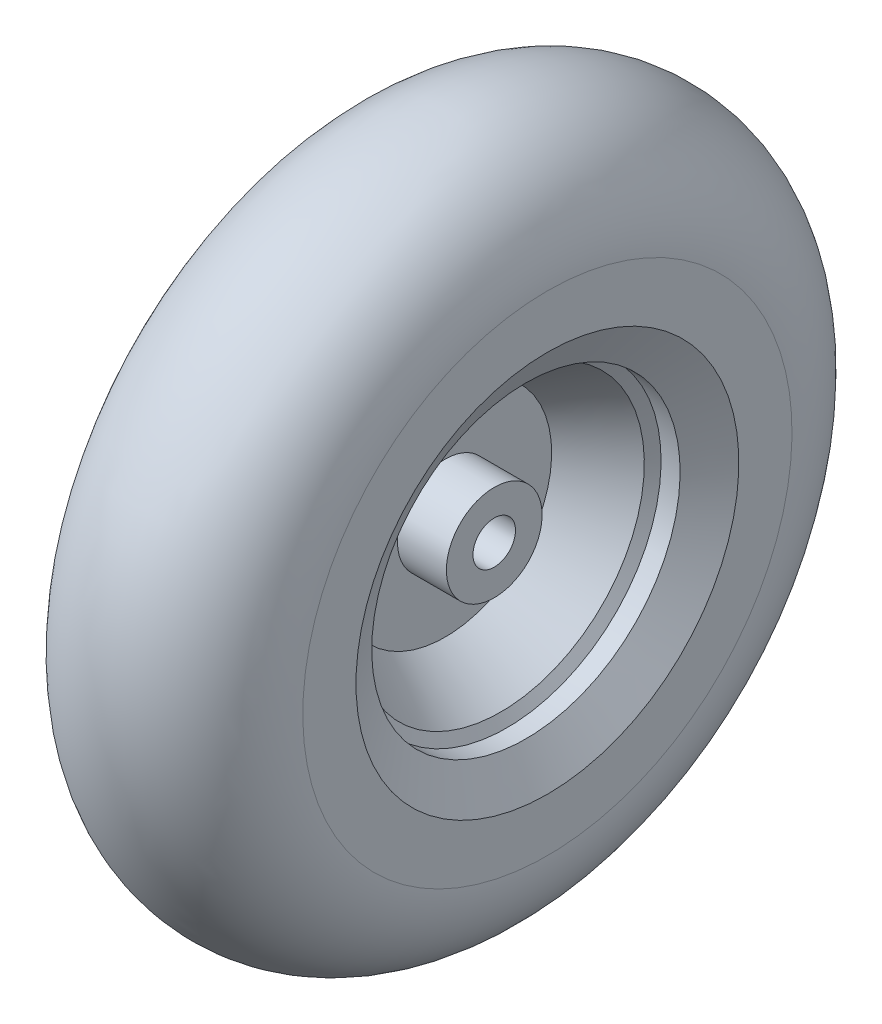
ISO-10303-21;
HEADER;
FILE_DESCRIPTION(('STEP AP214'),'2;1');
FILE_NAME('part.step','',(''),(''),'','','');
FILE_SCHEMA(('AUTOMOTIVE_DESIGN { 1 0 10303 214 1 1 1 1 }'));
ENDSEC;
DATA;
#1=APPLICATION_CONTEXT('core data for automotive mechanical design processes');
#2=APPLICATION_PROTOCOL_DEFINITION('international standard','automotive_design',2000,#1);
#3=PRODUCT_CONTEXT('',#1,'mechanical');
#4=PRODUCT('Part','Part','',(#3));
#5=PRODUCT_RELATED_PRODUCT_CATEGORY('part','',(#4));
#6=PRODUCT_DEFINITION_FORMATION('','',#4);
#7=PRODUCT_DEFINITION_CONTEXT('part definition',#1,'design');
#8=PRODUCT_DEFINITION('design','',#6,#7);
#9=PRODUCT_DEFINITION_SHAPE('','',#8);
#10=(LENGTH_UNIT() NAMED_UNIT(*) SI_UNIT(.MILLI.,.METRE.));
#11=(NAMED_UNIT(*) PLANE_ANGLE_UNIT() SI_UNIT($,.RADIAN.));
#12=(NAMED_UNIT(*) SI_UNIT($,.STERADIAN.) SOLID_ANGLE_UNIT());
#13=UNCERTAINTY_MEASURE_WITH_UNIT(LENGTH_MEASURE(1.E-05),#10,'distance_accuracy_value','');
#14=(GEOMETRIC_REPRESENTATION_CONTEXT(3) GLOBAL_UNCERTAINTY_ASSIGNED_CONTEXT((#13)) GLOBAL_UNIT_ASSIGNED_CONTEXT((#10,
#11,#12)) REPRESENTATION_CONTEXT('',''));
#15=CARTESIAN_POINT('',(0.,0.,0.));
#16=DIRECTION('',(0.,0.,1.));
#17=DIRECTION('',(1.,0.,0.));
#18=AXIS2_PLACEMENT_3D('',#15,#16,#17);
#19=CARTESIAN_POINT('',(0.,0.,0.));
#20=DIRECTION('',(1.,0.,0.));
#21=DIRECTION('',(0.,1.,0.));
#22=AXIS2_PLACEMENT_3D('',#19,#20,#21);
#23=TOROIDAL_SURFACE('',#22,115.,50.);
#24=CARTESIAN_POINT('',(-50.,0.,0.));
#25=DIRECTION('',(1.,0.,0.));
#26=DIRECTION('',(0.,1.,0.));
#27=AXIS2_PLACEMENT_3D('',#24,#25,#26);
#28=CIRCLE('',#27,115.);
#29=CARTESIAN_POINT('',(-50.,115.,0.));
#30=VERTEX_POINT('',#29);
#31=EDGE_CURVE('E12',#30,#30,#28,.T.);
#32=ORIENTED_EDGE('',*,*,#31,.T.);
#33=EDGE_LOOP('',(#32));
#34=FACE_BOUND('',#33,.T.);
#35=CARTESIAN_POINT('',(50.,0.,0.));
#36=DIRECTION('',(1.,0.,0.));
#37=DIRECTION('',(0.,1.,0.));
#38=AXIS2_PLACEMENT_3D('',#35,#36,#37);
#39=CIRCLE('',#38,115.);
#40=CARTESIAN_POINT('',(50.,115.,0.));
#41=VERTEX_POINT('',#40);
#42=EDGE_CURVE('E98',#41,#41,#39,.T.);
#43=ORIENTED_EDGE('',*,*,#42,.F.);
#44=EDGE_LOOP('',(#43));
#45=FACE_BOUND('',#44,.T.);
#46=ADVANCED_FACE('F40',(#34,#45),#23,.T.);
#47=CARTESIAN_POINT('',(-50.,115.,0.));
#48=DIRECTION('',(-1.,0.,0.));
#49=DIRECTION('',(0.,-1.,0.));
#50=AXIS2_PLACEMENT_3D('',#47,#48,#49);
#51=PLANE('',#50);
#52=CARTESIAN_POINT('',(-50.,0.,0.));
#53=DIRECTION('',(1.,0.,0.));
#54=DIRECTION('',(0.,1.,0.));
#55=AXIS2_PLACEMENT_3D('',#52,#53,#54);
#56=CIRCLE('',#55,90.);
#57=CARTESIAN_POINT('',(-50.,90.,0.));
#58=VERTEX_POINT('',#57);
#59=EDGE_CURVE('E46',#58,#58,#56,.T.);
#60=ORIENTED_EDGE('',*,*,#59,.T.);
#61=EDGE_LOOP('',(#60));
#62=FACE_BOUND('',#61,.T.);
#63=ORIENTED_EDGE('',*,*,#31,.F.);
#64=EDGE_LOOP('',(#63));
#65=FACE_BOUND('',#64,.T.);
#66=ADVANCED_FACE('F106',(#62,#65),#51,.T.);
#67=CARTESIAN_POINT('',(-50.,0.,0.));
#68=DIRECTION('',(-1.,0.,0.));
#69=DIRECTION('',(0.,-1.,0.));
#70=AXIS2_PLACEMENT_3D('',#67,#68,#69);
#71=CONICAL_SURFACE('',#70,90.,1.0471975511966);
#72=CARTESIAN_POINT('',(-39.8963702891815,0.,0.));
#73=DIRECTION('',(1.,0.,0.));
#74=DIRECTION('',(0.,1.,0.));
#75=AXIS2_PLACEMENT_3D('',#72,#73,#74);
#76=CIRCLE('',#75,72.5);
#77=CARTESIAN_POINT('',(-39.8963702891815,72.5,0.));
#78=VERTEX_POINT('',#77);
#79=EDGE_CURVE('E50',#78,#78,#76,.T.);
#80=ORIENTED_EDGE('',*,*,#79,.T.);
#81=EDGE_LOOP('',(#80));
#82=FACE_BOUND('',#81,.T.);
#83=ORIENTED_EDGE('',*,*,#59,.F.);
#84=EDGE_LOOP('',(#83));
#85=FACE_BOUND('',#84,.T.);
#86=ADVANCED_FACE('F110',(#82,#85),#71,.F.);
#87=CARTESIAN_POINT('',(0.,0.,0.));
#88=DIRECTION('',(1.,0.,0.));
#89=DIRECTION('',(0.,1.,0.));
#90=AXIS2_PLACEMENT_3D('',#87,#88,#89);
#91=CYLINDRICAL_SURFACE('',#90,72.5);
#92=CARTESIAN_POINT('',(-30.95,0.,0.));
#93=DIRECTION('',(1.,0.,0.));
#94=DIRECTION('',(0.,1.,0.));
#95=AXIS2_PLACEMENT_3D('',#92,#93,#94);
#96=CIRCLE('',#95,72.5);
#97=CARTESIAN_POINT('',(-30.95,72.5,0.));
#98=VERTEX_POINT('',#97);
#99=EDGE_CURVE('E54',#98,#98,#96,.T.);
#100=ORIENTED_EDGE('',*,*,#99,.T.);
#101=EDGE_LOOP('',(#100));
#102=FACE_BOUND('',#101,.T.);
#103=ORIENTED_EDGE('',*,*,#79,.F.);
#104=EDGE_LOOP('',(#103));
#105=FACE_BOUND('',#104,.T.);
#106=ADVANCED_FACE('F114',(#102,#105),#91,.F.);
#107=CARTESIAN_POINT('',(-30.95,0.,0.));
#108=DIRECTION('',(-1.,0.,0.));
#109=DIRECTION('',(0.,-1.,0.));
#110=AXIS2_PLACEMENT_3D('',#107,#108,#109);
#111=CONICAL_SURFACE('',#110,72.5,1.0471975511966);
#112=CARTESIAN_POINT('',(-28.0632486540519,0.,0.));
#113=DIRECTION('',(1.,0.,0.));
#114=DIRECTION('',(0.,1.,0.));
#115=AXIS2_PLACEMENT_3D('',#112,#113,#114);
#116=CIRCLE('',#115,67.5);
#117=CARTESIAN_POINT('',(-28.0632486540519,67.5,0.));
#118=VERTEX_POINT('',#117);
#119=EDGE_CURVE('E59',#118,#118,#116,.T.);
#120=ORIENTED_EDGE('',*,*,#119,.T.);
#121=EDGE_LOOP('',(#120));
#122=FACE_BOUND('',#121,.T.);
#123=ORIENTED_EDGE('',*,*,#99,.F.);
#124=EDGE_LOOP('',(#123));
#125=FACE_BOUND('',#124,.T.);
#126=ADVANCED_FACE('F121',(#122,#125),#111,.F.);
#127=CARTESIAN_POINT('',(-28.0632486540519,0.,0.));
#128=DIRECTION('',(-1.,0.,0.));
#129=DIRECTION('',(0.,-1.,0.));
#130=AXIS2_PLACEMENT_3D('',#127,#128,#129);
#131=CONICAL_SURFACE('',#130,67.5,0.591302384221919);
#132=CARTESIAN_POINT('',(-2.00000000000001,0.,0.));
#133=DIRECTION('',(1.,0.,0.));
#134=DIRECTION('',(0.,1.,0.));
#135=AXIS2_PLACEMENT_3D('',#132,#133,#134);
#136=CIRCLE('',#135,50.);
#137=CARTESIAN_POINT('',(-2.00000000000001,50.,0.));
#138=VERTEX_POINT('',#137);
#139=EDGE_CURVE('E62',#138,#138,#136,.T.);
#140=ORIENTED_EDGE('',*,*,#139,.T.);
#141=EDGE_LOOP('',(#140));
#142=FACE_BOUND('',#141,.T.);
#143=ORIENTED_EDGE('',*,*,#119,.F.);
#144=EDGE_LOOP('',(#143));
#145=FACE_BOUND('',#144,.T.);
#146=ADVANCED_FACE('F125',(#142,#145),#131,.F.);
#147=CARTESIAN_POINT('',(-2.00000000000001,50.,0.));
#148=DIRECTION('',(-1.,0.,0.));
#149=DIRECTION('',(0.,-1.,0.));
#150=AXIS2_PLACEMENT_3D('',#147,#148,#149);
#151=PLANE('',#150);
#152=CARTESIAN_POINT('',(-2.00000000000001,0.,0.));
#153=DIRECTION('',(1.,0.,0.));
#154=DIRECTION('',(0.,1.,0.));
#155=AXIS2_PLACEMENT_3D('',#152,#153,#154);
#156=CIRCLE('',#155,22.5);
#157=CARTESIAN_POINT('',(-2.00000000000001,22.5,0.));
#158=VERTEX_POINT('',#157);
#159=EDGE_CURVE('E65',#158,#158,#156,.T.);
#160=ORIENTED_EDGE('',*,*,#159,.T.);
#161=EDGE_LOOP('',(#160));
#162=FACE_BOUND('',#161,.T.);
#163=ORIENTED_EDGE('',*,*,#139,.F.);
#164=EDGE_LOOP('',(#163));
#165=FACE_BOUND('',#164,.T.);
#166=ADVANCED_FACE('F129',(#162,#165),#151,.T.);
#167=CARTESIAN_POINT('',(0.,0.,0.));
#168=DIRECTION('',(1.,0.,0.));
#169=DIRECTION('',(0.,1.,0.));
#170=AXIS2_PLACEMENT_3D('',#167,#168,#169);
#171=CYLINDRICAL_SURFACE('',#170,22.5);
#172=CARTESIAN_POINT('',(-40.,0.,0.));
#173=DIRECTION('',(1.,0.,0.));
#174=DIRECTION('',(0.,1.,0.));
#175=AXIS2_PLACEMENT_3D('',#172,#173,#174);
#176=CIRCLE('',#175,22.5);
#177=CARTESIAN_POINT('',(-40.,22.5,0.));
#178=VERTEX_POINT('',#177);
#179=EDGE_CURVE('E68',#178,#178,#176,.T.);
#180=ORIENTED_EDGE('',*,*,#179,.T.);
#181=EDGE_LOOP('',(#180));
#182=FACE_BOUND('',#181,.T.);
#183=ORIENTED_EDGE('',*,*,#159,.F.);
#184=EDGE_LOOP('',(#183));
#185=FACE_BOUND('',#184,.T.);
#186=ADVANCED_FACE('F133',(#182,#185),#171,.T.);
#187=CARTESIAN_POINT('',(-40.,22.5,0.));
#188=DIRECTION('',(-1.,0.,0.));
#189=DIRECTION('',(0.,-1.,0.));
#190=AXIS2_PLACEMENT_3D('',#187,#188,#189);
#191=PLANE('',#190);
#192=CARTESIAN_POINT('',(-40.,0.,0.));
#193=DIRECTION('',(1.,0.,0.));
#194=DIRECTION('',(0.,1.,0.));
#195=AXIS2_PLACEMENT_3D('',#192,#193,#194);
#196=CIRCLE('',#195,10.);
#197=CARTESIAN_POINT('',(-40.,10.,0.));
#198=VERTEX_POINT('',#197);
#199=EDGE_CURVE('E71',#198,#198,#196,.T.);
#200=ORIENTED_EDGE('',*,*,#199,.T.);
#201=EDGE_LOOP('',(#200));
#202=FACE_BOUND('',#201,.T.);
#203=ORIENTED_EDGE('',*,*,#179,.F.);
#204=EDGE_LOOP('',(#203));
#205=FACE_BOUND('',#204,.T.);
#206=ADVANCED_FACE('F137',(#202,#205),#191,.T.);
#207=CARTESIAN_POINT('',(0.,0.,0.));
#208=DIRECTION('',(1.,0.,0.));
#209=DIRECTION('',(0.,1.,0.));
#210=AXIS2_PLACEMENT_3D('',#207,#208,#209);
#211=CYLINDRICAL_SURFACE('',#210,10.);
#212=CARTESIAN_POINT('',(25.,0.,0.));
#213=DIRECTION('',(1.,0.,0.));
#214=DIRECTION('',(0.,1.,0.));
#215=AXIS2_PLACEMENT_3D('',#212,#213,#214);
#216=CIRCLE('',#215,10.);
#217=CARTESIAN_POINT('',(25.,10.,0.));
#218=VERTEX_POINT('',#217);
#219=EDGE_CURVE('E74',#218,#218,#216,.T.);
#220=ORIENTED_EDGE('',*,*,#219,.T.);
#221=EDGE_LOOP('',(#220));
#222=FACE_BOUND('',#221,.T.);
#223=ORIENTED_EDGE('',*,*,#199,.F.);
#224=EDGE_LOOP('',(#223));
#225=FACE_BOUND('',#224,.T.);
#226=ADVANCED_FACE('F141',(#222,#225),#211,.F.);
#227=CARTESIAN_POINT('',(25.,10.,0.));
#228=DIRECTION('',(1.,0.,0.));
#229=DIRECTION('',(0.,1.,0.));
#230=AXIS2_PLACEMENT_3D('',#227,#228,#229);
#231=PLANE('',#230);
#232=CARTESIAN_POINT('',(25.,0.,0.));
#233=DIRECTION('',(1.,0.,0.));
#234=DIRECTION('',(0.,1.,0.));
#235=AXIS2_PLACEMENT_3D('',#232,#233,#234);
#236=CIRCLE('',#235,22.5);
#237=CARTESIAN_POINT('',(25.,22.5,0.));
#238=VERTEX_POINT('',#237);
#239=EDGE_CURVE('E77',#238,#238,#236,.T.);
#240=ORIENTED_EDGE('',*,*,#239,.T.);
#241=EDGE_LOOP('',(#240));
#242=FACE_BOUND('',#241,.T.);
#243=ORIENTED_EDGE('',*,*,#219,.F.);
#244=EDGE_LOOP('',(#243));
#245=FACE_BOUND('',#244,.T.);
#246=ADVANCED_FACE('F145',(#242,#245),#231,.T.);
#247=CARTESIAN_POINT('',(0.,0.,0.));
#248=DIRECTION('',(1.,0.,0.));
#249=DIRECTION('',(0.,1.,0.));
#250=AXIS2_PLACEMENT_3D('',#247,#248,#249);
#251=CYLINDRICAL_SURFACE('',#250,22.5);
#252=CARTESIAN_POINT('',(2.,0.,0.));
#253=DIRECTION('',(1.,0.,0.));
#254=DIRECTION('',(0.,1.,0.));
#255=AXIS2_PLACEMENT_3D('',#252,#253,#254);
#256=CIRCLE('',#255,22.5);
#257=CARTESIAN_POINT('',(2.,22.5,0.));
#258=VERTEX_POINT('',#257);
#259=EDGE_CURVE('E80',#258,#258,#256,.T.);
#260=ORIENTED_EDGE('',*,*,#259,.T.);
#261=EDGE_LOOP('',(#260));
#262=FACE_BOUND('',#261,.T.);
#263=ORIENTED_EDGE('',*,*,#239,.F.);
#264=EDGE_LOOP('',(#263));
#265=FACE_BOUND('',#264,.T.);
#266=ADVANCED_FACE('F149',(#262,#265),#251,.T.);
#267=CARTESIAN_POINT('',(2.,22.5,0.));
#268=DIRECTION('',(1.,0.,0.));
#269=DIRECTION('',(0.,1.,0.));
#270=AXIS2_PLACEMENT_3D('',#267,#268,#269);
#271=PLANE('',#270);
#272=CARTESIAN_POINT('',(2.00000000000001,0.,0.));
#273=DIRECTION('',(1.,0.,0.));
#274=DIRECTION('',(0.,1.,0.));
#275=AXIS2_PLACEMENT_3D('',#272,#273,#274);
#276=CIRCLE('',#275,50.);
#277=CARTESIAN_POINT('',(2.,50.,0.));
#278=VERTEX_POINT('',#277);
#279=EDGE_CURVE('E83',#278,#278,#276,.T.);
#280=ORIENTED_EDGE('',*,*,#279,.T.);
#281=EDGE_LOOP('',(#280));
#282=FACE_BOUND('',#281,.T.);
#283=ORIENTED_EDGE('',*,*,#259,.F.);
#284=EDGE_LOOP('',(#283));
#285=FACE_BOUND('',#284,.T.);
#286=ADVANCED_FACE('F153',(#282,#285),#271,.T.);
#287=CARTESIAN_POINT('',(2.00000000000001,0.,0.));
#288=DIRECTION('',(1.,0.,0.));
#289=DIRECTION('',(0.,1.,0.));
#290=AXIS2_PLACEMENT_3D('',#287,#288,#289);
#291=CONICAL_SURFACE('',#290,50.,0.591302384221919);
#292=CARTESIAN_POINT('',(28.0632486540519,0.,0.));
#293=DIRECTION('',(1.,0.,0.));
#294=DIRECTION('',(0.,1.,0.));
#295=AXIS2_PLACEMENT_3D('',#292,#293,#294);
#296=CIRCLE('',#295,67.5);
#297=CARTESIAN_POINT('',(28.0632486540519,67.5,0.));
#298=VERTEX_POINT('',#297);
#299=EDGE_CURVE('E86',#298,#298,#296,.T.);
#300=ORIENTED_EDGE('',*,*,#299,.T.);
#301=EDGE_LOOP('',(#300));
#302=FACE_BOUND('',#301,.T.);
#303=ORIENTED_EDGE('',*,*,#279,.F.);
#304=EDGE_LOOP('',(#303));
#305=FACE_BOUND('',#304,.T.);
#306=ADVANCED_FACE('F157',(#302,#305),#291,.F.);
#307=CARTESIAN_POINT('',(28.0632486540519,0.,0.));
#308=DIRECTION('',(1.,0.,0.));
#309=DIRECTION('',(0.,1.,0.));
#310=AXIS2_PLACEMENT_3D('',#307,#308,#309);
#311=CONICAL_SURFACE('',#310,67.5,1.0471975511966);
#312=CARTESIAN_POINT('',(30.95,0.,0.));
#313=DIRECTION('',(1.,0.,0.));
#314=DIRECTION('',(0.,1.,0.));
#315=AXIS2_PLACEMENT_3D('',#312,#313,#314);
#316=CIRCLE('',#315,72.5);
#317=CARTESIAN_POINT('',(30.95,72.5,0.));
#318=VERTEX_POINT('',#317);
#319=EDGE_CURVE('E89',#318,#318,#316,.T.);
#320=ORIENTED_EDGE('',*,*,#319,.T.);
#321=EDGE_LOOP('',(#320));
#322=FACE_BOUND('',#321,.T.);
#323=ORIENTED_EDGE('',*,*,#299,.F.);
#324=EDGE_LOOP('',(#323));
#325=FACE_BOUND('',#324,.T.);
#326=ADVANCED_FACE('F161',(#322,#325),#311,.F.);
#327=CARTESIAN_POINT('',(0.,0.,0.));
#328=DIRECTION('',(1.,0.,0.));
#329=DIRECTION('',(0.,1.,0.));
#330=AXIS2_PLACEMENT_3D('',#327,#328,#329);
#331=CYLINDRICAL_SURFACE('',#330,72.5);
#332=CARTESIAN_POINT('',(39.8963702891815,0.,0.));
#333=DIRECTION('',(1.,0.,0.));
#334=DIRECTION('',(0.,1.,0.));
#335=AXIS2_PLACEMENT_3D('',#332,#333,#334);
#336=CIRCLE('',#335,72.5);
#337=CARTESIAN_POINT('',(39.8963702891815,72.5,0.));
#338=VERTEX_POINT('',#337);
#339=EDGE_CURVE('E92',#338,#338,#336,.T.);
#340=ORIENTED_EDGE('',*,*,#339,.T.);
#341=EDGE_LOOP('',(#340));
#342=FACE_BOUND('',#341,.T.);
#343=ORIENTED_EDGE('',*,*,#319,.F.);
#344=EDGE_LOOP('',(#343));
#345=FACE_BOUND('',#344,.T.);
#346=ADVANCED_FACE('F165',(#342,#345),#331,.F.);
#347=CARTESIAN_POINT('',(39.8963702891815,0.,0.));
#348=DIRECTION('',(1.,0.,0.));
#349=DIRECTION('',(0.,1.,0.));
#350=AXIS2_PLACEMENT_3D('',#347,#348,#349);
#351=CONICAL_SURFACE('',#350,72.5,1.0471975511966);
#352=CARTESIAN_POINT('',(50.,0.,0.));
#353=DIRECTION('',(1.,0.,0.));
#354=DIRECTION('',(0.,1.,0.));
#355=AXIS2_PLACEMENT_3D('',#352,#353,#354);
#356=CIRCLE('',#355,90.);
#357=CARTESIAN_POINT('',(50.,90.,0.));
#358=VERTEX_POINT('',#357);
#359=EDGE_CURVE('E95',#358,#358,#356,.T.);
#360=ORIENTED_EDGE('',*,*,#359,.T.);
#361=EDGE_LOOP('',(#360));
#362=FACE_BOUND('',#361,.T.);
#363=ORIENTED_EDGE('',*,*,#339,.F.);
#364=EDGE_LOOP('',(#363));
#365=FACE_BOUND('',#364,.T.);
#366=ADVANCED_FACE('F169',(#362,#365),#351,.F.);
#367=CARTESIAN_POINT('',(50.,90.,0.));
#368=DIRECTION('',(1.,0.,0.));
#369=DIRECTION('',(0.,1.,0.));
#370=AXIS2_PLACEMENT_3D('',#367,#368,#369);
#371=PLANE('',#370);
#372=ORIENTED_EDGE('',*,*,#42,.T.);
#373=EDGE_LOOP('',(#372));
#374=FACE_BOUND('',#373,.T.);
#375=ORIENTED_EDGE('',*,*,#359,.F.);
#376=EDGE_LOOP('',(#375));
#377=FACE_BOUND('',#376,.T.);
#378=ADVANCED_FACE('F102',(#374,#377),#371,.T.);
#379=CLOSED_SHELL('',(#46,#66,#86,#106,#126,#146,#166,#186,#206,#226,#246,#266,#286,#306,#326,
#346,#366,#378));
#380=MANIFOLD_SOLID_BREP('B2',#379);
#381=ADVANCED_BREP_SHAPE_REPRESENTATION('',(#18,#380),#14);
#382=SHAPE_DEFINITION_REPRESENTATION(#9,#381);
ENDSEC;
END-ISO-10303-21;
